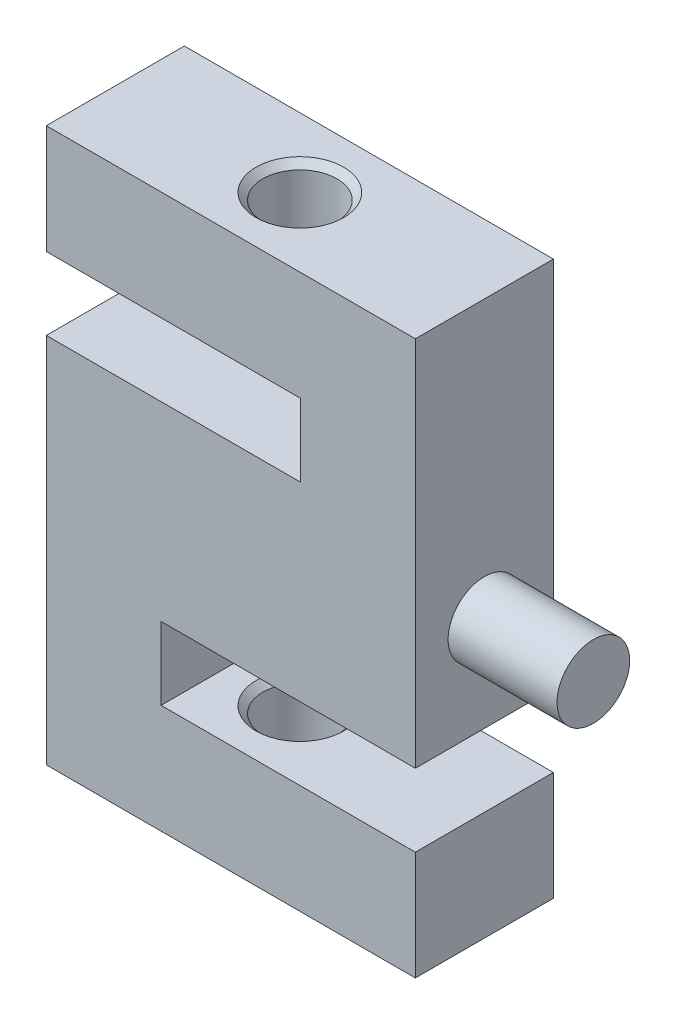
ISO-10303-21;
HEADER;
FILE_DESCRIPTION(('STEP AP214'),'2;1');
FILE_NAME('part.step','',(''),(''),'','','');
FILE_SCHEMA(('AUTOMOTIVE_DESIGN { 1 0 10303 214 1 1 1 1 }'));
ENDSEC;
DATA;
#1=APPLICATION_CONTEXT('core data for automotive mechanical design processes');
#2=APPLICATION_PROTOCOL_DEFINITION('international standard','automotive_design',2000,#1);
#3=PRODUCT_CONTEXT('',#1,'mechanical');
#4=PRODUCT('Part','Part','',(#3));
#5=PRODUCT_RELATED_PRODUCT_CATEGORY('part','',(#4));
#6=PRODUCT_DEFINITION_FORMATION('','',#4);
#7=PRODUCT_DEFINITION_CONTEXT('part definition',#1,'design');
#8=PRODUCT_DEFINITION('design','',#6,#7);
#9=PRODUCT_DEFINITION_SHAPE('','',#8);
#10=(LENGTH_UNIT() NAMED_UNIT(*) SI_UNIT(.MILLI.,.METRE.));
#11=(NAMED_UNIT(*) PLANE_ANGLE_UNIT() SI_UNIT($,.RADIAN.));
#12=(NAMED_UNIT(*) SI_UNIT($,.STERADIAN.) SOLID_ANGLE_UNIT());
#13=UNCERTAINTY_MEASURE_WITH_UNIT(LENGTH_MEASURE(1.E-05),#10,'distance_accuracy_value','');
#14=(GEOMETRIC_REPRESENTATION_CONTEXT(3) GLOBAL_UNCERTAINTY_ASSIGNED_CONTEXT((#13)) GLOBAL_UNIT_ASSIGNED_CONTEXT((#10,
#11,#12)) REPRESENTATION_CONTEXT('',''));
#15=CARTESIAN_POINT('',(0.,0.,0.));
#16=DIRECTION('',(0.,0.,1.));
#17=DIRECTION('',(1.,0.,0.));
#18=AXIS2_PLACEMENT_3D('',#15,#16,#17);
#19=CARTESIAN_POINT('',(40.4,0.,0.));
#20=DIRECTION('',(-1.,0.,0.));
#21=DIRECTION('',(0.,0.,1.));
#22=AXIS2_PLACEMENT_3D('',#19,#20,#21);
#23=CYLINDRICAL_SURFACE('',#22,5.);
#24=CARTESIAN_POINT('',(40.4,0.,0.));
#25=DIRECTION('',(1.,0.,0.));
#26=DIRECTION('',(0.,0.,-1.));
#27=AXIS2_PLACEMENT_3D('',#24,#25,#26);
#28=CIRCLE('',#27,5.);
#29=CARTESIAN_POINT('',(40.4,0.,-5.));
#30=VERTEX_POINT('',#29);
#31=EDGE_CURVE('E11',#30,#30,#28,.T.);
#32=ORIENTED_EDGE('',*,*,#31,.F.);
#33=EDGE_LOOP('',(#32));
#34=FACE_BOUND('',#33,.T.);
#35=CARTESIAN_POINT('',(25.4,0.,0.));
#36=DIRECTION('',(1.,0.,0.));
#37=DIRECTION('',(0.,0.,-1.));
#38=AXIS2_PLACEMENT_3D('',#35,#36,#37);
#39=CIRCLE('',#38,5.);
#40=CARTESIAN_POINT('',(25.4,0.,-5.));
#41=VERTEX_POINT('',#40);
#42=EDGE_CURVE('E54',#41,#41,#39,.T.);
#43=ORIENTED_EDGE('',*,*,#42,.T.);
#44=EDGE_LOOP('',(#43));
#45=FACE_BOUND('',#44,.T.);
#46=ADVANCED_FACE('F51',(#34,#45),#23,.T.);
#47=CARTESIAN_POINT('',(40.4,0.,0.));
#48=DIRECTION('',(1.,0.,0.));
#49=DIRECTION('',(0.,0.,-1.));
#50=AXIS2_PLACEMENT_3D('',#47,#48,#49);
#51=PLANE('',#50);
#52=ORIENTED_EDGE('',*,*,#31,.T.);
#53=EDGE_LOOP('',(#52));
#54=FACE_BOUND('',#53,.T.);
#55=ADVANCED_FACE('F66',(#54),#51,.T.);
#56=CARTESIAN_POINT('',(25.4,0.,0.));
#57=DIRECTION('',(1.,0.,0.));
#58=DIRECTION('',(0.,0.,-1.));
#59=AXIS2_PLACEMENT_3D('',#56,#57,#58);
#60=PLANE('',#59);
#61=ORIENTED_EDGE('',*,*,#42,.F.);
#62=EDGE_LOOP('',(#61));
#63=FACE_BOUND('',#62,.T.);
#64=ADVANCED_FACE('F64',(#63),#60,.F.);
#65=CLOSED_SHELL('',(#46,#55,#64));
#66=MANIFOLD_SOLID_BREP('B2',#65);
#67=CARTESIAN_POINT('',(25.4,38.1,9.5));
#68=DIRECTION('',(0.,-1.,0.));
#69=DIRECTION('',(0.,0.,-1.));
#70=AXIS2_PLACEMENT_3D('',#67,#68,#69);
#71=PLANE('',#70);
#72=DIRECTION('',(-1.,0.,0.));
#73=VECTOR('',#72,1.);
#74=CARTESIAN_POINT('',(25.4,38.1,-9.5));
#75=LINE('',#74,#73);
#76=CARTESIAN_POINT('',(25.4,38.1,-9.5));
#77=VERTEX_POINT('',#76);
#78=CARTESIAN_POINT('',(-25.4,38.1,-9.5));
#79=VERTEX_POINT('',#78);
#80=EDGE_CURVE('E237',#77,#79,#75,.T.);
#81=ORIENTED_EDGE('',*,*,#80,.T.);
#82=DIRECTION('',(0.,0.,-1.));
#83=VECTOR('',#82,1.);
#84=CARTESIAN_POINT('',(-25.4,38.1,9.5));
#85=LINE('',#84,#83);
#86=CARTESIAN_POINT('',(-25.4,38.1,9.5));
#87=VERTEX_POINT('',#86);
#88=EDGE_CURVE('E210',#87,#79,#85,.T.);
#89=ORIENTED_EDGE('',*,*,#88,.F.);
#90=DIRECTION('',(-1.,0.,0.));
#91=VECTOR('',#90,1.);
#92=CARTESIAN_POINT('',(25.4,38.1,9.5));
#93=LINE('',#92,#91);
#94=CARTESIAN_POINT('',(25.4,38.1,9.5));
#95=VERTEX_POINT('',#94);
#96=EDGE_CURVE('E201',#95,#87,#93,.T.);
#97=ORIENTED_EDGE('',*,*,#96,.F.);
#98=DIRECTION('',(0.,0.,-1.));
#99=VECTOR('',#98,1.);
#100=CARTESIAN_POINT('',(25.4,38.1,9.5));
#101=LINE('',#100,#99);
#102=EDGE_CURVE('E246',#95,#77,#101,.T.);
#103=ORIENTED_EDGE('',*,*,#102,.T.);
#104=EDGE_LOOP('',(#81,#89,#97,#103));
#105=FACE_BOUND('',#104,.T.);
#106=CARTESIAN_POINT('',(0.,38.1,0.));
#107=DIRECTION('',(0.,1.,0.));
#108=DIRECTION('',(0.,0.,1.));
#109=AXIS2_PLACEMENT_3D('',#106,#107,#108);
#110=CIRCLE('',#109,6.025);
#111=CARTESIAN_POINT('',(0.,38.1,6.025));
#112=VERTEX_POINT('',#111);
#113=EDGE_CURVE('E561',#112,#112,#110,.T.);
#114=ORIENTED_EDGE('',*,*,#113,.F.);
#115=EDGE_LOOP('',(#114));
#116=FACE_BOUND('',#115,.T.);
#117=ADVANCED_FACE('F98',(#105,#116),#71,.F.);
#118=CARTESIAN_POINT('',(9.6,13.1,9.5));
#119=DIRECTION('',(0.,-1.,0.));
#120=DIRECTION('',(1.,0.,0.));
#121=AXIS2_PLACEMENT_3D('',#118,#119,#120);
#122=PLANE('',#121);
#123=DIRECTION('',(-1.,0.,0.));
#124=VECTOR('',#123,1.);
#125=CARTESIAN_POINT('',(9.6,13.1,-9.5));
#126=LINE('',#125,#124);
#127=CARTESIAN_POINT('',(9.6,13.1,-9.5));
#128=VERTEX_POINT('',#127);
#129=CARTESIAN_POINT('',(-25.4,13.1,-9.5));
#130=VERTEX_POINT('',#129);
#131=EDGE_CURVE('E219',#128,#130,#126,.T.);
#132=ORIENTED_EDGE('',*,*,#131,.T.);
#133=DIRECTION('',(0.,0.,-1.));
#134=VECTOR('',#133,1.);
#135=CARTESIAN_POINT('',(-25.4,13.1,9.5));
#136=LINE('',#135,#134);
#137=CARTESIAN_POINT('',(-25.4,13.1,9.5));
#138=VERTEX_POINT('',#137);
#139=EDGE_CURVE('E49',#138,#130,#136,.T.);
#140=ORIENTED_EDGE('',*,*,#139,.F.);
#141=DIRECTION('',(-1.,0.,0.));
#142=VECTOR('',#141,1.);
#143=CARTESIAN_POINT('',(9.6,13.1,9.5));
#144=LINE('',#143,#142);
#145=CARTESIAN_POINT('',(9.6,13.1,9.5));
#146=VERTEX_POINT('',#145);
#147=EDGE_CURVE('E242',#146,#138,#144,.T.);
#148=ORIENTED_EDGE('',*,*,#147,.F.);
#149=DIRECTION('',(0.,0.,-1.));
#150=VECTOR('',#149,1.);
#151=CARTESIAN_POINT('',(9.6,13.1,9.5));
#152=LINE('',#151,#150);
#153=EDGE_CURVE('E215',#146,#128,#152,.T.);
#154=ORIENTED_EDGE('',*,*,#153,.T.);
#155=EDGE_LOOP('',(#132,#140,#148,#154));
#156=FACE_BOUND('',#155,.T.);
#157=ADVANCED_FACE('F100',(#156),#122,.F.);
#158=CARTESIAN_POINT('',(-25.4,13.1,9.5));
#159=DIRECTION('',(1.,0.,0.));
#160=DIRECTION('',(0.,1.,0.));
#161=AXIS2_PLACEMENT_3D('',#158,#159,#160);
#162=PLANE('',#161);
#163=DIRECTION('',(0.,-1.,0.));
#164=VECTOR('',#163,1.);
#165=CARTESIAN_POINT('',(-25.4,13.1,-9.5));
#166=LINE('',#165,#164);
#167=CARTESIAN_POINT('',(-25.4,-38.1,-9.5));
#168=VERTEX_POINT('',#167);
#169=EDGE_CURVE('E222',#130,#168,#166,.T.);
#170=ORIENTED_EDGE('',*,*,#169,.T.);
#171=DIRECTION('',(0.,0.,-1.));
#172=VECTOR('',#171,1.);
#173=CARTESIAN_POINT('',(-25.4,-38.1,9.5));
#174=LINE('',#173,#172);
#175=CARTESIAN_POINT('',(-25.4,-38.1,9.5));
#176=VERTEX_POINT('',#175);
#177=EDGE_CURVE('E107',#176,#168,#174,.T.);
#178=ORIENTED_EDGE('',*,*,#177,.F.);
#179=DIRECTION('',(0.,-1.,0.));
#180=VECTOR('',#179,1.);
#181=CARTESIAN_POINT('',(-25.4,13.1,9.5));
#182=LINE('',#181,#180);
#183=EDGE_CURVE('E170',#138,#176,#182,.T.);
#184=ORIENTED_EDGE('',*,*,#183,.F.);
#185=ORIENTED_EDGE('',*,*,#139,.T.);
#186=EDGE_LOOP('',(#170,#178,#184,#185));
#187=FACE_BOUND('',#186,.T.);
#188=ADVANCED_FACE('F325',(#187),#162,.F.);
#189=CARTESIAN_POINT('',(-25.4,-38.1,9.5));
#190=DIRECTION('',(0.,1.,0.));
#191=DIRECTION('',(0.,0.,1.));
#192=AXIS2_PLACEMENT_3D('',#189,#190,#191);
#193=PLANE('',#192);
#194=CARTESIAN_POINT('',(0.,-38.1,0.));
#195=DIRECTION('',(0.,-1.,0.));
#196=DIRECTION('',(0.,0.,-1.));
#197=AXIS2_PLACEMENT_3D('',#194,#195,#196);
#198=CIRCLE('',#197,6.025);
#199=CARTESIAN_POINT('',(0.,-38.1,-6.025));
#200=VERTEX_POINT('',#199);
#201=EDGE_CURVE('E564',#200,#200,#198,.T.);
#202=ORIENTED_EDGE('',*,*,#201,.F.);
#203=EDGE_LOOP('',(#202));
#204=FACE_BOUND('',#203,.T.);
#205=DIRECTION('',(1.,0.,0.));
#206=VECTOR('',#205,1.);
#207=CARTESIAN_POINT('',(-25.4,-38.1,-9.5));
#208=LINE('',#207,#206);
#209=CARTESIAN_POINT('',(25.4,-38.1,-9.5));
#210=VERTEX_POINT('',#209);
#211=EDGE_CURVE('E225',#168,#210,#208,.T.);
#212=ORIENTED_EDGE('',*,*,#211,.T.);
#213=DIRECTION('',(0.,0.,-1.));
#214=VECTOR('',#213,1.);
#215=CARTESIAN_POINT('',(25.4,-38.1,9.5));
#216=LINE('',#215,#214);
#217=CARTESIAN_POINT('',(25.4,-38.1,9.5));
#218=VERTEX_POINT('',#217);
#219=EDGE_CURVE('E261',#218,#210,#216,.T.);
#220=ORIENTED_EDGE('',*,*,#219,.F.);
#221=DIRECTION('',(1.,0.,0.));
#222=VECTOR('',#221,1.);
#223=CARTESIAN_POINT('',(-25.4,-38.1,9.5));
#224=LINE('',#223,#222);
#225=EDGE_CURVE('E269',#176,#218,#224,.T.);
#226=ORIENTED_EDGE('',*,*,#225,.F.);
#227=ORIENTED_EDGE('',*,*,#177,.T.);
#228=EDGE_LOOP('',(#212,#220,#226,#227));
#229=FACE_BOUND('',#228,.T.);
#230=ADVANCED_FACE('F267',(#204,#229),#193,.F.);
#231=CARTESIAN_POINT('',(25.4,-38.1,9.5));
#232=DIRECTION('',(-1.,0.,0.));
#233=DIRECTION('',(0.,-1.,0.));
#234=AXIS2_PLACEMENT_3D('',#231,#232,#233);
#235=PLANE('',#234);
#236=DIRECTION('',(0.,1.,0.));
#237=VECTOR('',#236,1.);
#238=CARTESIAN_POINT('',(25.4,-38.1,-9.5));
#239=LINE('',#238,#237);
#240=CARTESIAN_POINT('',(25.4,-23.1,-9.5));
#241=VERTEX_POINT('',#240);
#242=EDGE_CURVE('E227',#210,#241,#239,.T.);
#243=ORIENTED_EDGE('',*,*,#242,.T.);
#244=DIRECTION('',(0.,0.,-1.));
#245=VECTOR('',#244,1.);
#246=CARTESIAN_POINT('',(25.4,-23.1,9.5));
#247=LINE('',#246,#245);
#248=CARTESIAN_POINT('',(25.4,-23.1,9.5));
#249=VERTEX_POINT('',#248);
#250=EDGE_CURVE('E258',#249,#241,#247,.T.);
#251=ORIENTED_EDGE('',*,*,#250,.F.);
#252=DIRECTION('',(0.,1.,0.));
#253=VECTOR('',#252,1.);
#254=CARTESIAN_POINT('',(25.4,-38.1,9.5));
#255=LINE('',#254,#253);
#256=EDGE_CURVE('E287',#218,#249,#255,.T.);
#257=ORIENTED_EDGE('',*,*,#256,.F.);
#258=ORIENTED_EDGE('',*,*,#219,.T.);
#259=EDGE_LOOP('',(#243,#251,#257,#258));
#260=FACE_BOUND('',#259,.T.);
#261=ADVANCED_FACE('F278',(#260),#235,.F.);
#262=CARTESIAN_POINT('',(25.4,-23.1,9.5));
#263=DIRECTION('',(0.,-1.,0.));
#264=DIRECTION('',(1.,0.,0.));
#265=AXIS2_PLACEMENT_3D('',#262,#263,#264);
#266=PLANE('',#265);
#267=CARTESIAN_POINT('',(0.,-23.1,0.));
#268=DIRECTION('',(0.,-1.,0.));
#269=DIRECTION('',(0.,0.,-1.));
#270=AXIS2_PLACEMENT_3D('',#267,#268,#269);
#271=CIRCLE('',#270,6.025);
#272=CARTESIAN_POINT('',(0.,-23.1,-6.025));
#273=VERTEX_POINT('',#272);
#274=EDGE_CURVE('E553',#273,#273,#271,.T.);
#275=ORIENTED_EDGE('',*,*,#274,.T.);
#276=EDGE_LOOP('',(#275));
#277=FACE_BOUND('',#276,.T.);
#278=DIRECTION('',(-1.,0.,0.));
#279=VECTOR('',#278,1.);
#280=CARTESIAN_POINT('',(25.4,-23.1,-9.5));
#281=LINE('',#280,#279);
#282=CARTESIAN_POINT('',(-9.60000000000001,-23.1,-9.5));
#283=VERTEX_POINT('',#282);
#284=EDGE_CURVE('E229',#241,#283,#281,.T.);
#285=ORIENTED_EDGE('',*,*,#284,.T.);
#286=DIRECTION('',(0.,0.,-1.));
#287=VECTOR('',#286,1.);
#288=CARTESIAN_POINT('',(-9.60000000000001,-23.1,9.5));
#289=LINE('',#288,#287);
#290=CARTESIAN_POINT('',(-9.60000000000001,-23.1,9.5));
#291=VERTEX_POINT('',#290);
#292=EDGE_CURVE('E255',#291,#283,#289,.T.);
#293=ORIENTED_EDGE('',*,*,#292,.F.);
#294=DIRECTION('',(-1.,0.,0.));
#295=VECTOR('',#294,1.);
#296=CARTESIAN_POINT('',(25.4,-23.1,9.5));
#297=LINE('',#296,#295);
#298=EDGE_CURVE('E284',#249,#291,#297,.T.);
#299=ORIENTED_EDGE('',*,*,#298,.F.);
#300=ORIENTED_EDGE('',*,*,#250,.T.);
#301=EDGE_LOOP('',(#285,#293,#299,#300));
#302=FACE_BOUND('',#301,.T.);
#303=ADVANCED_FACE('F282',(#277,#302),#266,.F.);
#304=CARTESIAN_POINT('',(-9.60000000000001,-23.1,9.5));
#305=DIRECTION('',(-1.,0.,0.));
#306=DIRECTION('',(0.,0.,1.));
#307=AXIS2_PLACEMENT_3D('',#304,#305,#306);
#308=PLANE('',#307);
#309=DIRECTION('',(0.,1.,0.));
#310=VECTOR('',#309,1.);
#311=CARTESIAN_POINT('',(-9.60000000000001,-23.1,-9.5));
#312=LINE('',#311,#310);
#313=CARTESIAN_POINT('',(-9.60000000000001,-13.1,-9.5));
#314=VERTEX_POINT('',#313);
#315=EDGE_CURVE('E231',#283,#314,#312,.T.);
#316=ORIENTED_EDGE('',*,*,#315,.T.);
#317=DIRECTION('',(0.,0.,-1.));
#318=VECTOR('',#317,1.);
#319=CARTESIAN_POINT('',(-9.60000000000001,-13.1,9.5));
#320=LINE('',#319,#318);
#321=CARTESIAN_POINT('',(-9.60000000000001,-13.1,9.5));
#322=VERTEX_POINT('',#321);
#323=EDGE_CURVE('E252',#322,#314,#320,.T.);
#324=ORIENTED_EDGE('',*,*,#323,.F.);
#325=DIRECTION('',(0.,1.,0.));
#326=VECTOR('',#325,1.);
#327=CARTESIAN_POINT('',(-9.60000000000001,-23.1,9.5));
#328=LINE('',#327,#326);
#329=EDGE_CURVE('E286',#291,#322,#328,.T.);
#330=ORIENTED_EDGE('',*,*,#329,.F.);
#331=ORIENTED_EDGE('',*,*,#292,.T.);
#332=EDGE_LOOP('',(#316,#324,#330,#331));
#333=FACE_BOUND('',#332,.T.);
#334=ADVANCED_FACE('F333',(#333),#308,.F.);
#335=CARTESIAN_POINT('',(-9.60000000000001,-13.1,9.5));
#336=DIRECTION('',(0.,1.,0.));
#337=DIRECTION('',(-1.,0.,0.));
#338=AXIS2_PLACEMENT_3D('',#335,#336,#337);
#339=PLANE('',#338);
#340=DIRECTION('',(1.,0.,0.));
#341=VECTOR('',#340,1.);
#342=CARTESIAN_POINT('',(-9.60000000000001,-13.1,-9.5));
#343=LINE('',#342,#341);
#344=CARTESIAN_POINT('',(25.4,-13.1,-9.5));
#345=VERTEX_POINT('',#344);
#346=EDGE_CURVE('E233',#314,#345,#343,.T.);
#347=ORIENTED_EDGE('',*,*,#346,.T.);
#348=DIRECTION('',(0.,0.,-1.));
#349=VECTOR('',#348,1.);
#350=CARTESIAN_POINT('',(25.4,-13.1,9.5));
#351=LINE('',#350,#349);
#352=CARTESIAN_POINT('',(25.4,-13.1,9.5));
#353=VERTEX_POINT('',#352);
#354=EDGE_CURVE('E249',#353,#345,#351,.T.);
#355=ORIENTED_EDGE('',*,*,#354,.F.);
#356=DIRECTION('',(1.,0.,0.));
#357=VECTOR('',#356,1.);
#358=CARTESIAN_POINT('',(-9.60000000000001,-13.1,9.5));
#359=LINE('',#358,#357);
#360=EDGE_CURVE('E289',#322,#353,#359,.T.);
#361=ORIENTED_EDGE('',*,*,#360,.F.);
#362=ORIENTED_EDGE('',*,*,#323,.T.);
#363=EDGE_LOOP('',(#347,#355,#361,#362));
#364=FACE_BOUND('',#363,.T.);
#365=ADVANCED_FACE('F330',(#364),#339,.F.);
#366=CARTESIAN_POINT('',(25.4,-13.1,9.5));
#367=DIRECTION('',(-1.,0.,0.));
#368=DIRECTION('',(0.,0.,1.));
#369=AXIS2_PLACEMENT_3D('',#366,#367,#368);
#370=PLANE('',#369);
#371=DIRECTION('',(0.,1.,0.));
#372=VECTOR('',#371,1.);
#373=CARTESIAN_POINT('',(25.4,-13.1,-9.5));
#374=LINE('',#373,#372);
#375=EDGE_CURVE('E235',#345,#77,#374,.T.);
#376=ORIENTED_EDGE('',*,*,#375,.T.);
#377=ORIENTED_EDGE('',*,*,#102,.F.);
#378=DIRECTION('',(0.,1.,0.));
#379=VECTOR('',#378,1.);
#380=CARTESIAN_POINT('',(25.4,-13.1,9.5));
#381=LINE('',#380,#379);
#382=EDGE_CURVE('E295',#353,#95,#381,.T.);
#383=ORIENTED_EDGE('',*,*,#382,.F.);
#384=ORIENTED_EDGE('',*,*,#354,.T.);
#385=EDGE_LOOP('',(#376,#377,#383,#384));
#386=FACE_BOUND('',#385,.T.);
#387=ADVANCED_FACE('F301',(#386),#370,.F.);
#388=CARTESIAN_POINT('',(-25.4,38.1,9.5));
#389=DIRECTION('',(1.,0.,0.));
#390=DIRECTION('',(0.,0.,-1.));
#391=AXIS2_PLACEMENT_3D('',#388,#389,#390);
#392=PLANE('',#391);
#393=DIRECTION('',(0.,-1.,0.));
#394=VECTOR('',#393,1.);
#395=CARTESIAN_POINT('',(-25.4,38.1,-9.5));
#396=LINE('',#395,#394);
#397=CARTESIAN_POINT('',(-25.4,23.1,-9.5));
#398=VERTEX_POINT('',#397);
#399=EDGE_CURVE('E209',#79,#398,#396,.T.);
#400=ORIENTED_EDGE('',*,*,#399,.T.);
#401=DIRECTION('',(0.,0.,-1.));
#402=VECTOR('',#401,1.);
#403=CARTESIAN_POINT('',(-25.4,23.1,9.5));
#404=LINE('',#403,#402);
#405=CARTESIAN_POINT('',(-25.4,23.1,9.5));
#406=VERTEX_POINT('',#405);
#407=EDGE_CURVE('E206',#406,#398,#404,.T.);
#408=ORIENTED_EDGE('',*,*,#407,.F.);
#409=DIRECTION('',(0.,-1.,0.));
#410=VECTOR('',#409,1.);
#411=CARTESIAN_POINT('',(-25.4,38.1,9.5));
#412=LINE('',#411,#410);
#413=EDGE_CURVE('E195',#87,#406,#412,.T.);
#414=ORIENTED_EDGE('',*,*,#413,.F.);
#415=ORIENTED_EDGE('',*,*,#88,.T.);
#416=EDGE_LOOP('',(#400,#408,#414,#415));
#417=FACE_BOUND('',#416,.T.);
#418=ADVANCED_FACE('F207',(#417),#392,.F.);
#419=CARTESIAN_POINT('',(-25.4,23.1,9.5));
#420=DIRECTION('',(0.,1.,0.));
#421=DIRECTION('',(-1.,0.,0.));
#422=AXIS2_PLACEMENT_3D('',#419,#420,#421);
#423=PLANE('',#422);
#424=CARTESIAN_POINT('',(0.,23.1,0.));
#425=DIRECTION('',(0.,1.,0.));
#426=DIRECTION('',(0.,0.,1.));
#427=AXIS2_PLACEMENT_3D('',#424,#425,#426);
#428=CIRCLE('',#427,6.025);
#429=CARTESIAN_POINT('',(0.,23.1,6.025));
#430=VERTEX_POINT('',#429);
#431=EDGE_CURVE('E557',#430,#430,#428,.T.);
#432=ORIENTED_EDGE('',*,*,#431,.T.);
#433=EDGE_LOOP('',(#432));
#434=FACE_BOUND('',#433,.T.);
#435=DIRECTION('',(1.,0.,0.));
#436=VECTOR('',#435,1.);
#437=CARTESIAN_POINT('',(-25.4,23.1,-9.5));
#438=LINE('',#437,#436);
#439=CARTESIAN_POINT('',(9.6,23.1,-9.5));
#440=VERTEX_POINT('',#439);
#441=EDGE_CURVE('E156',#398,#440,#438,.T.);
#442=ORIENTED_EDGE('',*,*,#441,.T.);
#443=DIRECTION('',(0.,0.,-1.));
#444=VECTOR('',#443,1.);
#445=CARTESIAN_POINT('',(9.6,23.1,9.5));
#446=LINE('',#445,#444);
#447=CARTESIAN_POINT('',(9.6,23.1,9.5));
#448=VERTEX_POINT('',#447);
#449=EDGE_CURVE('E211',#448,#440,#446,.T.);
#450=ORIENTED_EDGE('',*,*,#449,.F.);
#451=DIRECTION('',(1.,0.,0.));
#452=VECTOR('',#451,1.);
#453=CARTESIAN_POINT('',(-25.4,23.1,9.5));
#454=LINE('',#453,#452);
#455=EDGE_CURVE('E199',#406,#448,#454,.T.);
#456=ORIENTED_EDGE('',*,*,#455,.F.);
#457=ORIENTED_EDGE('',*,*,#407,.T.);
#458=EDGE_LOOP('',(#442,#450,#456,#457));
#459=FACE_BOUND('',#458,.T.);
#460=ADVANCED_FACE('F213',(#434,#459),#423,.F.);
#461=CARTESIAN_POINT('',(9.6,23.1,9.5));
#462=DIRECTION('',(1.,0.,0.));
#463=DIRECTION('',(0.,1.,0.));
#464=AXIS2_PLACEMENT_3D('',#461,#462,#463);
#465=PLANE('',#464);
#466=DIRECTION('',(0.,-1.,0.));
#467=VECTOR('',#466,1.);
#468=CARTESIAN_POINT('',(9.6,23.1,-9.5));
#469=LINE('',#468,#467);
#470=EDGE_CURVE('E162',#440,#128,#469,.T.);
#471=ORIENTED_EDGE('',*,*,#470,.T.);
#472=ORIENTED_EDGE('',*,*,#153,.F.);
#473=DIRECTION('',(0.,-1.,0.));
#474=VECTOR('',#473,1.);
#475=CARTESIAN_POINT('',(9.6,23.1,9.5));
#476=LINE('',#475,#474);
#477=EDGE_CURVE('E115',#448,#146,#476,.T.);
#478=ORIENTED_EDGE('',*,*,#477,.F.);
#479=ORIENTED_EDGE('',*,*,#449,.T.);
#480=EDGE_LOOP('',(#471,#472,#478,#479));
#481=FACE_BOUND('',#480,.T.);
#482=ADVANCED_FACE('F309',(#481),#465,.F.);
#483=CARTESIAN_POINT('',(0.,0.,9.5));
#484=DIRECTION('',(0.,0.,1.));
#485=DIRECTION('',(1.,0.,0.));
#486=AXIS2_PLACEMENT_3D('',#483,#484,#485);
#487=PLANE('',#486);
#488=ORIENTED_EDGE('',*,*,#147,.T.);
#489=ORIENTED_EDGE('',*,*,#183,.T.);
#490=ORIENTED_EDGE('',*,*,#225,.T.);
#491=ORIENTED_EDGE('',*,*,#256,.T.);
#492=ORIENTED_EDGE('',*,*,#298,.T.);
#493=ORIENTED_EDGE('',*,*,#329,.T.);
#494=ORIENTED_EDGE('',*,*,#360,.T.);
#495=ORIENTED_EDGE('',*,*,#382,.T.);
#496=ORIENTED_EDGE('',*,*,#96,.T.);
#497=ORIENTED_EDGE('',*,*,#413,.T.);
#498=ORIENTED_EDGE('',*,*,#455,.T.);
#499=ORIENTED_EDGE('',*,*,#477,.T.);
#500=EDGE_LOOP('',(#488,#489,#490,#491,#492,#493,#494,#495,#496,#497,#498,#499));
#501=FACE_BOUND('',#500,.T.);
#502=ADVANCED_FACE('F197',(#501),#487,.T.);
#503=CARTESIAN_POINT('',(0.,0.,-9.5));
#504=DIRECTION('',(0.,0.,1.));
#505=DIRECTION('',(1.,0.,0.));
#506=AXIS2_PLACEMENT_3D('',#503,#504,#505);
#507=PLANE('',#506);
#508=ORIENTED_EDGE('',*,*,#131,.F.);
#509=ORIENTED_EDGE('',*,*,#470,.F.);
#510=ORIENTED_EDGE('',*,*,#441,.F.);
#511=ORIENTED_EDGE('',*,*,#399,.F.);
#512=ORIENTED_EDGE('',*,*,#80,.F.);
#513=ORIENTED_EDGE('',*,*,#375,.F.);
#514=ORIENTED_EDGE('',*,*,#346,.F.);
#515=ORIENTED_EDGE('',*,*,#315,.F.);
#516=ORIENTED_EDGE('',*,*,#284,.F.);
#517=ORIENTED_EDGE('',*,*,#242,.F.);
#518=ORIENTED_EDGE('',*,*,#211,.F.);
#519=ORIENTED_EDGE('',*,*,#169,.F.);
#520=EDGE_LOOP('',(#508,#509,#510,#511,#512,#513,#514,#515,#516,#517,#518,#519));
#521=FACE_BOUND('',#520,.T.);
#522=ADVANCED_FACE('F273',(#521),#507,.F.);
#523=CARTESIAN_POINT('',(0.,24.025,0.));
#524=DIRECTION('',(0.,-1.,0.));
#525=DIRECTION('',(0.,0.,-1.));
#526=AXIS2_PLACEMENT_3D('',#523,#524,#525);
#527=CONICAL_SURFACE('',#526,5.1,0.785398163397448);
#528=ORIENTED_EDGE('',*,*,#431,.F.);
#529=EDGE_LOOP('',(#528));
#530=FACE_BOUND('',#529,.T.);
#531=CARTESIAN_POINT('',(0.,24.025,0.));
#532=DIRECTION('',(0.,1.,0.));
#533=DIRECTION('',(0.,0.,1.));
#534=AXIS2_PLACEMENT_3D('',#531,#532,#533);
#535=CIRCLE('',#534,5.1);
#536=CARTESIAN_POINT('',(0.,24.025,5.1));
#537=VERTEX_POINT('',#536);
#538=EDGE_CURVE('E223',#537,#537,#535,.T.);
#539=ORIENTED_EDGE('',*,*,#538,.T.);
#540=EDGE_LOOP('',(#539));
#541=FACE_BOUND('',#540,.T.);
#542=ADVANCED_FACE('F395',(#530,#541),#527,.F.);
#543=CARTESIAN_POINT('',(0.,38.1,0.));
#544=DIRECTION('',(0.,1.,0.));
#545=DIRECTION('',(0.,0.,1.));
#546=AXIS2_PLACEMENT_3D('',#543,#544,#545);
#547=CYLINDRICAL_SURFACE('',#546,5.1);
#548=ORIENTED_EDGE('',*,*,#538,.F.);
#549=EDGE_LOOP('',(#548));
#550=FACE_BOUND('',#549,.T.);
#551=CARTESIAN_POINT('',(0.,37.175,0.));
#552=DIRECTION('',(0.,1.,0.));
#553=DIRECTION('',(0.,0.,1.));
#554=AXIS2_PLACEMENT_3D('',#551,#552,#553);
#555=CIRCLE('',#554,5.1);
#556=CARTESIAN_POINT('',(0.,37.175,5.1));
#557=VERTEX_POINT('',#556);
#558=EDGE_CURVE('E570',#557,#557,#555,.T.);
#559=ORIENTED_EDGE('',*,*,#558,.T.);
#560=EDGE_LOOP('',(#559));
#561=FACE_BOUND('',#560,.T.);
#562=ADVANCED_FACE('F400',(#550,#561),#547,.F.);
#563=CARTESIAN_POINT('',(0.,38.1,0.));
#564=DIRECTION('',(0.,1.,0.));
#565=DIRECTION('',(0.,0.,1.));
#566=AXIS2_PLACEMENT_3D('',#563,#564,#565);
#567=CONICAL_SURFACE('',#566,6.025,0.785398163397448);
#568=ORIENTED_EDGE('',*,*,#558,.F.);
#569=EDGE_LOOP('',(#568));
#570=FACE_BOUND('',#569,.T.);
#571=ORIENTED_EDGE('',*,*,#113,.T.);
#572=EDGE_LOOP('',(#571));
#573=FACE_BOUND('',#572,.T.);
#574=ADVANCED_FACE('F413',(#570,#573),#567,.F.);
#575=CARTESIAN_POINT('',(0.,-24.025,0.));
#576=DIRECTION('',(0.,1.,0.));
#577=DIRECTION('',(0.,0.,1.));
#578=AXIS2_PLACEMENT_3D('',#575,#576,#577);
#579=CONICAL_SURFACE('',#578,5.09999999999999,0.785398163397446);
#580=ORIENTED_EDGE('',*,*,#274,.F.);
#581=EDGE_LOOP('',(#580));
#582=FACE_BOUND('',#581,.T.);
#583=CARTESIAN_POINT('',(0.,-24.025,0.));
#584=DIRECTION('',(0.,-1.,0.));
#585=DIRECTION('',(0.,0.,-1.));
#586=AXIS2_PLACEMENT_3D('',#583,#584,#585);
#587=CIRCLE('',#586,5.09999999999999);
#588=CARTESIAN_POINT('',(0.,-24.025,-5.09999999999999));
#589=VERTEX_POINT('',#588);
#590=EDGE_CURVE('E556',#589,#589,#587,.T.);
#591=ORIENTED_EDGE('',*,*,#590,.T.);
#592=EDGE_LOOP('',(#591));
#593=FACE_BOUND('',#592,.T.);
#594=ADVANCED_FACE('F426',(#582,#593),#579,.F.);
#595=CARTESIAN_POINT('',(0.,-38.1,0.));
#596=DIRECTION('',(0.,-1.,0.));
#597=DIRECTION('',(0.,0.,-1.));
#598=AXIS2_PLACEMENT_3D('',#595,#596,#597);
#599=CYLINDRICAL_SURFACE('',#598,5.09999999999999);
#600=ORIENTED_EDGE('',*,*,#590,.F.);
#601=EDGE_LOOP('',(#600));
#602=FACE_BOUND('',#601,.T.);
#603=CARTESIAN_POINT('',(0.,-37.175,0.));
#604=DIRECTION('',(0.,-1.,0.));
#605=DIRECTION('',(0.,0.,-1.));
#606=AXIS2_PLACEMENT_3D('',#603,#604,#605);
#607=CIRCLE('',#606,5.09999999999999);
#608=CARTESIAN_POINT('',(0.,-37.175,-5.09999999999999));
#609=VERTEX_POINT('',#608);
#610=EDGE_CURVE('E558',#609,#609,#607,.T.);
#611=ORIENTED_EDGE('',*,*,#610,.T.);
#612=EDGE_LOOP('',(#611));
#613=FACE_BOUND('',#612,.T.);
#614=ADVANCED_FACE('F445',(#602,#613),#599,.F.);
#615=CARTESIAN_POINT('',(0.,-38.1,0.));
#616=DIRECTION('',(0.,-1.,0.));
#617=DIRECTION('',(0.,0.,-1.));
#618=AXIS2_PLACEMENT_3D('',#615,#616,#617);
#619=CONICAL_SURFACE('',#618,6.025,0.785398163397451);
#620=ORIENTED_EDGE('',*,*,#610,.F.);
#621=EDGE_LOOP('',(#620));
#622=FACE_BOUND('',#621,.T.);
#623=ORIENTED_EDGE('',*,*,#201,.T.);
#624=EDGE_LOOP('',(#623));
#625=FACE_BOUND('',#624,.T.);
#626=ADVANCED_FACE('F450',(#622,#625),#619,.F.);
#627=CLOSED_SHELL('',(#117,#157,#188,#230,#261,#303,#334,#365,#387,#418,#460,#482,#502,#522,
#542,#562,#574,#594,#614,#626));
#628=MANIFOLD_SOLID_BREP('B6',#627);
#629=ADVANCED_BREP_SHAPE_REPRESENTATION('',(#18,#66,#628),#14);
#630=SHAPE_DEFINITION_REPRESENTATION(#9,#629);
ENDSEC;
END-ISO-10303-21;
